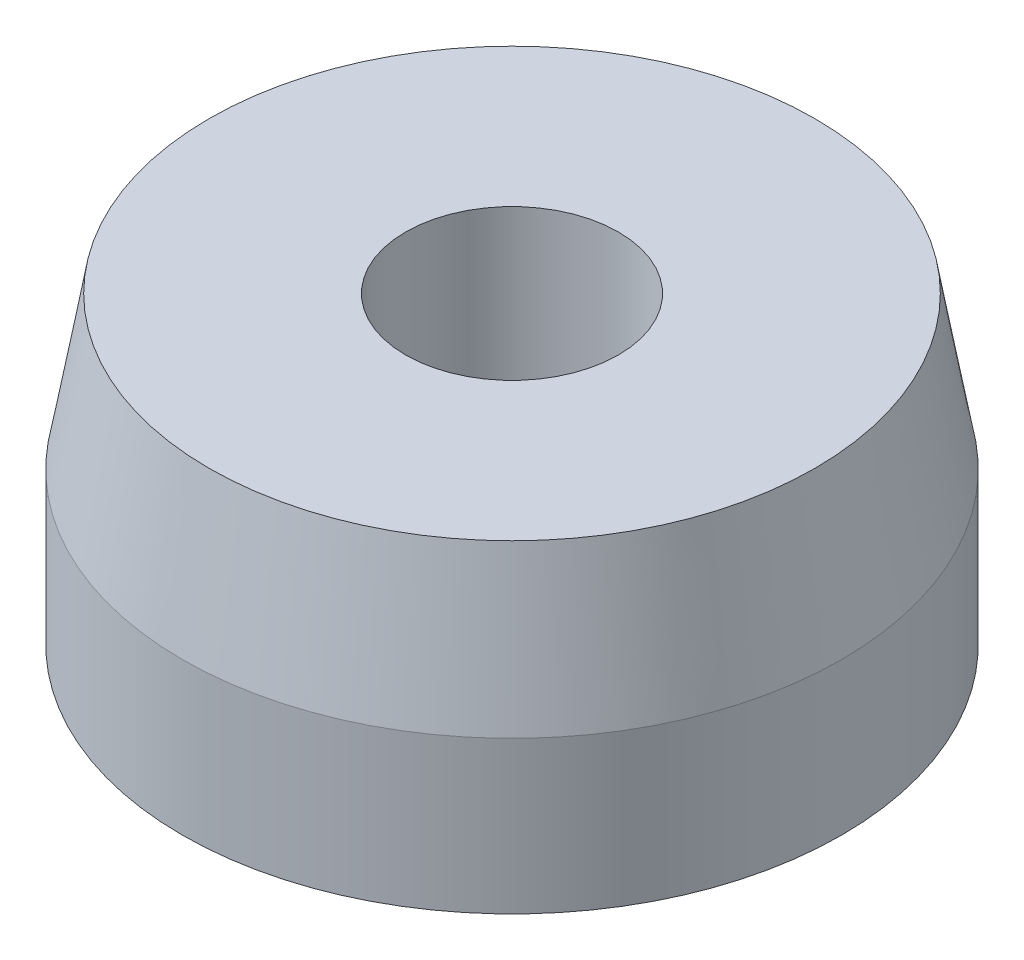
ISO-10303-21;
HEADER;
FILE_DESCRIPTION(('STEP AP214'),'2;1');
FILE_NAME('part.step','',(''),(''),'','','');
FILE_SCHEMA(('AUTOMOTIVE_DESIGN { 1 0 10303 214 1 1 1 1 }'));
ENDSEC;
DATA;
#1=APPLICATION_CONTEXT('core data for automotive mechanical design processes');
#2=APPLICATION_PROTOCOL_DEFINITION('international standard','automotive_design',2000,#1);
#3=PRODUCT_CONTEXT('',#1,'mechanical');
#4=PRODUCT('Part','Part','',(#3));
#5=PRODUCT_RELATED_PRODUCT_CATEGORY('part','',(#4));
#6=PRODUCT_DEFINITION_FORMATION('','',#4);
#7=PRODUCT_DEFINITION_CONTEXT('part definition',#1,'design');
#8=PRODUCT_DEFINITION('design','',#6,#7);
#9=PRODUCT_DEFINITION_SHAPE('','',#8);
#10=(LENGTH_UNIT() NAMED_UNIT(*) SI_UNIT(.MILLI.,.METRE.));
#11=(NAMED_UNIT(*) PLANE_ANGLE_UNIT() SI_UNIT($,.RADIAN.));
#12=(NAMED_UNIT(*) SI_UNIT($,.STERADIAN.) SOLID_ANGLE_UNIT());
#13=UNCERTAINTY_MEASURE_WITH_UNIT(LENGTH_MEASURE(1.E-05),#10,'distance_accuracy_value','');
#14=(GEOMETRIC_REPRESENTATION_CONTEXT(3) GLOBAL_UNCERTAINTY_ASSIGNED_CONTEXT((#13)) GLOBAL_UNIT_ASSIGNED_CONTEXT((#10,
#11,#12)) REPRESENTATION_CONTEXT('',''));
#15=CARTESIAN_POINT('',(0.,0.,0.));
#16=DIRECTION('',(0.,0.,1.));
#17=DIRECTION('',(1.,0.,0.));
#18=AXIS2_PLACEMENT_3D('',#15,#16,#17);
#19=CARTESIAN_POINT('',(0.,10.,0.));
#20=DIRECTION('',(0.,1.,0.));
#21=DIRECTION('',(0.,0.,1.));
#22=AXIS2_PLACEMENT_3D('',#19,#20,#21);
#23=PLANE('',#22);
#24=CARTESIAN_POINT('',(0.,10.,0.));
#25=DIRECTION('',(0.,1.,0.));
#26=DIRECTION('',(0.,0.,1.));
#27=AXIS2_PLACEMENT_3D('',#24,#25,#26);
#28=CIRCLE('',#27,9.95536509645765);
#29=CARTESIAN_POINT('',(0.,10.,9.95536509645765));
#30=VERTEX_POINT('',#29);
#31=EDGE_CURVE('E38',#30,#30,#28,.T.);
#32=ORIENTED_EDGE('',*,*,#31,.T.);
#33=EDGE_LOOP('',(#32));
#34=FACE_BOUND('',#33,.T.);
#35=CARTESIAN_POINT('',(0.,10.,0.));
#36=DIRECTION('',(0.,1.,0.));
#37=DIRECTION('',(0.,0.,1.));
#38=AXIS2_PLACEMENT_3D('',#35,#36,#37);
#39=CIRCLE('',#38,3.5);
#40=CARTESIAN_POINT('',(0.,10.,3.5));
#41=VERTEX_POINT('',#40);
#42=EDGE_CURVE('E46',#41,#41,#39,.T.);
#43=ORIENTED_EDGE('',*,*,#42,.F.);
#44=EDGE_LOOP('',(#43));
#45=FACE_BOUND('',#44,.T.);
#46=ADVANCED_FACE('F31',(#34,#45),#23,.T.);
#47=CARTESIAN_POINT('',(0.,0.,0.));
#48=DIRECTION('',(0.,1.,0.));
#49=DIRECTION('',(0.,0.,1.));
#50=AXIS2_PLACEMENT_3D('',#47,#48,#49);
#51=PLANE('',#50);
#52=CARTESIAN_POINT('',(0.,0.,0.));
#53=DIRECTION('',(0.,1.,0.));
#54=DIRECTION('',(0.,0.,1.));
#55=AXIS2_PLACEMENT_3D('',#52,#53,#54);
#56=CIRCLE('',#55,10.837);
#57=CARTESIAN_POINT('',(0.,0.,10.837));
#58=VERTEX_POINT('',#57);
#59=EDGE_CURVE('E42',#58,#58,#56,.T.);
#60=ORIENTED_EDGE('',*,*,#59,.F.);
#61=EDGE_LOOP('',(#60));
#62=FACE_BOUND('',#61,.T.);
#63=CARTESIAN_POINT('',(0.,0.,0.));
#64=DIRECTION('',(0.,1.,0.));
#65=DIRECTION('',(0.,0.,1.));
#66=AXIS2_PLACEMENT_3D('',#63,#64,#65);
#67=CIRCLE('',#66,3.5);
#68=CARTESIAN_POINT('',(0.,0.,3.5));
#69=VERTEX_POINT('',#68);
#70=EDGE_CURVE('E49',#69,#69,#67,.T.);
#71=ORIENTED_EDGE('',*,*,#70,.T.);
#72=EDGE_LOOP('',(#71));
#73=FACE_BOUND('',#72,.T.);
#74=ADVANCED_FACE('F59',(#62,#73),#51,.F.);
#75=CARTESIAN_POINT('',(0.,10.,0.));
#76=DIRECTION('',(0.,-1.,0.));
#77=DIRECTION('',(0.,0.,-1.));
#78=AXIS2_PLACEMENT_3D('',#75,#76,#77);
#79=CYLINDRICAL_SURFACE('',#78,10.837);
#80=CARTESIAN_POINT('',(0.,4.99999999999982,0.));
#81=DIRECTION('',(0.,1.,0.));
#82=DIRECTION('',(0.,0.,1.));
#83=AXIS2_PLACEMENT_3D('',#80,#81,#82);
#84=CIRCLE('',#83,10.837);
#85=CARTESIAN_POINT('',(0.,4.99999999999982,10.837));
#86=VERTEX_POINT('',#85);
#87=EDGE_CURVE('E10',#86,#86,#84,.F.);
#88=ORIENTED_EDGE('',*,*,#87,.T.);
#89=EDGE_LOOP('',(#88));
#90=FACE_BOUND('',#89,.T.);
#91=ORIENTED_EDGE('',*,*,#59,.T.);
#92=EDGE_LOOP('',(#91));
#93=FACE_BOUND('',#92,.T.);
#94=ADVANCED_FACE('F64',(#90,#93),#79,.T.);
#95=CARTESIAN_POINT('',(0.,10.,0.));
#96=DIRECTION('',(0.,-1.,0.));
#97=DIRECTION('',(0.,0.,-1.));
#98=AXIS2_PLACEMENT_3D('',#95,#96,#97);
#99=CYLINDRICAL_SURFACE('',#98,3.5);
#100=ORIENTED_EDGE('',*,*,#42,.T.);
#101=EDGE_LOOP('',(#100));
#102=FACE_BOUND('',#101,.T.);
#103=ORIENTED_EDGE('',*,*,#70,.F.);
#104=EDGE_LOOP('',(#103));
#105=FACE_BOUND('',#104,.T.);
#106=ADVANCED_FACE('F55',(#102,#105),#99,.F.);
#107=CARTESIAN_POINT('',(0.,10.,0.));
#108=DIRECTION('',(0.,-1.,0.));
#109=DIRECTION('',(0.,0.,-1.));
#110=AXIS2_PLACEMENT_3D('',#107,#108,#109);
#111=CONICAL_SURFACE('',#110,9.95536509645765,0.174532925199431);
#112=ORIENTED_EDGE('',*,*,#87,.F.);
#113=EDGE_LOOP('',(#112));
#114=FACE_BOUND('',#113,.T.);
#115=ORIENTED_EDGE('',*,*,#31,.F.);
#116=EDGE_LOOP('',(#115));
#117=FACE_BOUND('',#116,.T.);
#118=ADVANCED_FACE('F33',(#114,#117),#111,.T.);
#119=CLOSED_SHELL('',(#46,#74,#94,#106,#118));
#120=MANIFOLD_SOLID_BREP('B2',#119);
#121=ADVANCED_BREP_SHAPE_REPRESENTATION('',(#18,#120),#14);
#122=SHAPE_DEFINITION_REPRESENTATION(#9,#121);
ENDSEC;
END-ISO-10303-21;
